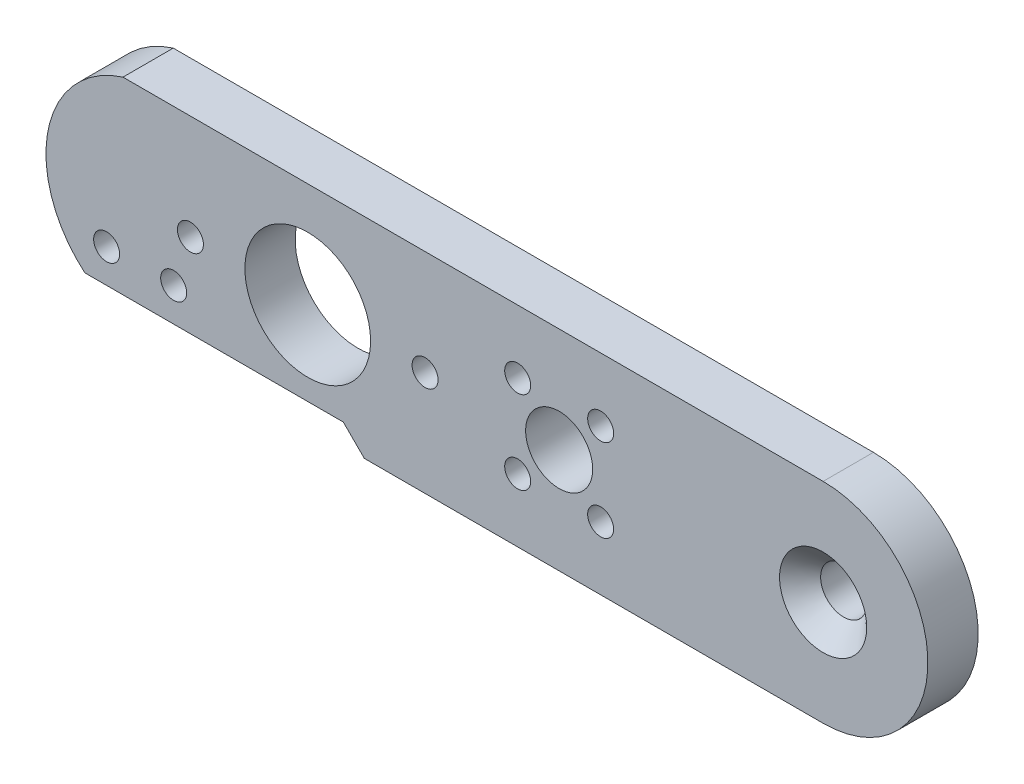
ISO-10303-21;
HEADER;
FILE_DESCRIPTION(('STEP AP214'),'2;1');
FILE_NAME('part.step','',(''),(''),'','','');
FILE_SCHEMA(('AUTOMOTIVE_DESIGN { 1 0 10303 214 1 1 1 1 }'));
ENDSEC;
DATA;
#1=APPLICATION_CONTEXT('core data for automotive mechanical design processes');
#2=APPLICATION_PROTOCOL_DEFINITION('international standard','automotive_design',2000,#1);
#3=PRODUCT_CONTEXT('',#1,'mechanical');
#4=PRODUCT('Part','Part','',(#3));
#5=PRODUCT_RELATED_PRODUCT_CATEGORY('part','',(#4));
#6=PRODUCT_DEFINITION_FORMATION('','',#4);
#7=PRODUCT_DEFINITION_CONTEXT('part definition',#1,'design');
#8=PRODUCT_DEFINITION('design','',#6,#7);
#9=PRODUCT_DEFINITION_SHAPE('','',#8);
#10=(LENGTH_UNIT() NAMED_UNIT(*) SI_UNIT(.MILLI.,.METRE.));
#11=(NAMED_UNIT(*) PLANE_ANGLE_UNIT() SI_UNIT($,.RADIAN.));
#12=(NAMED_UNIT(*) SI_UNIT($,.STERADIAN.) SOLID_ANGLE_UNIT());
#13=UNCERTAINTY_MEASURE_WITH_UNIT(LENGTH_MEASURE(1.E-05),#10,'distance_accuracy_value','');
#14=(GEOMETRIC_REPRESENTATION_CONTEXT(3) GLOBAL_UNCERTAINTY_ASSIGNED_CONTEXT((#13)) GLOBAL_UNIT_ASSIGNED_CONTEXT((#10,
#11,#12)) REPRESENTATION_CONTEXT('',''));
#15=CARTESIAN_POINT('',(0.,0.,0.));
#16=DIRECTION('',(0.,0.,1.));
#17=DIRECTION('',(1.,0.,0.));
#18=AXIS2_PLACEMENT_3D('',#15,#16,#17);
#19=CARTESIAN_POINT('',(-37.9889093793381,0.,6.));
#20=DIRECTION('',(0.,0.,1.));
#21=DIRECTION('',(1.,0.,0.));
#22=AXIS2_PLACEMENT_3D('',#19,#20,#21);
#23=PLANE('',#22);
#24=CARTESIAN_POINT('',(-43.8464721363555,-6.,6.));
#25=DIRECTION('',(0.,0.,1.));
#26=DIRECTION('',(1.,0.,0.));
#27=AXIS2_PLACEMENT_3D('',#24,#25,#26);
#28=CIRCLE('',#27,1.55);
#29=CARTESIAN_POINT('',(-42.2964721363555,-6.,6.));
#30=VERTEX_POINT('',#29);
#31=EDGE_CURVE('E250',#30,#30,#28,.T.);
#32=ORIENTED_EDGE('',*,*,#31,.F.);
#33=EDGE_LOOP('',(#32));
#34=FACE_BOUND('',#33,.T.);
#35=CARTESIAN_POINT('',(-35.8464721363555,-6.,6.));
#36=DIRECTION('',(0.,0.,1.));
#37=DIRECTION('',(1.,0.,0.));
#38=AXIS2_PLACEMENT_3D('',#35,#36,#37);
#39=CIRCLE('',#38,1.55);
#40=CARTESIAN_POINT('',(-34.2964721363555,-6.,6.));
#41=VERTEX_POINT('',#40);
#42=EDGE_CURVE('E254',#41,#41,#39,.T.);
#43=ORIENTED_EDGE('',*,*,#42,.F.);
#44=EDGE_LOOP('',(#43));
#45=FACE_BOUND('',#44,.T.);
#46=CARTESIAN_POINT('',(41.6532189288571,0.,6.));
#47=DIRECTION('',(0.,0.,1.));
#48=DIRECTION('',(1.,0.,0.));
#49=AXIS2_PLACEMENT_3D('',#46,#47,#48);
#50=CIRCLE('',#49,5.2);
#51=CARTESIAN_POINT('',(46.8532189288571,0.,6.));
#52=VERTEX_POINT('',#51);
#53=EDGE_CURVE('E253',#52,#52,#50,.T.);
#54=ORIENTED_EDGE('',*,*,#53,.F.);
#55=EDGE_LOOP('',(#54));
#56=FACE_BOUND('',#55,.T.);
#57=CARTESIAN_POINT('',(-19.8464721363555,0.,6.));
#58=DIRECTION('',(0.,0.,1.));
#59=DIRECTION('',(1.,0.,0.));
#60=AXIS2_PLACEMENT_3D('',#57,#58,#59);
#61=CIRCLE('',#60,7.5);
#62=CARTESIAN_POINT('',(-12.3464721363555,0.,6.));
#63=VERTEX_POINT('',#62);
#64=EDGE_CURVE('E270',#63,#63,#61,.T.);
#65=ORIENTED_EDGE('',*,*,#64,.F.);
#66=EDGE_LOOP('',(#65));
#67=FACE_BOUND('',#66,.T.);
#68=CARTESIAN_POINT('',(5.20378039533869,-4.94974746830586,6.));
#69=DIRECTION('',(0.,0.,1.));
#70=DIRECTION('',(1.,0.,0.));
#71=AXIS2_PLACEMENT_3D('',#68,#69,#70);
#72=CIRCLE('',#71,1.55);
#73=CARTESIAN_POINT('',(6.75378039533869,-4.94974746830586,6.));
#74=VERTEX_POINT('',#73);
#75=EDGE_CURVE('E282',#74,#74,#72,.T.);
#76=ORIENTED_EDGE('',*,*,#75,.F.);
#77=EDGE_LOOP('',(#76));
#78=FACE_BOUND('',#77,.T.);
#79=CARTESIAN_POINT('',(5.20378039533869,4.94974746830586,6.));
#80=DIRECTION('',(0.,0.,1.));
#81=DIRECTION('',(-1.,0.,0.));
#82=AXIS2_PLACEMENT_3D('',#79,#80,#81);
#83=CIRCLE('',#82,1.55);
#84=CARTESIAN_POINT('',(3.65378039533869,4.94974746830586,6.));
#85=VERTEX_POINT('',#84);
#86=EDGE_CURVE('E294',#85,#85,#83,.T.);
#87=ORIENTED_EDGE('',*,*,#86,.F.);
#88=EDGE_LOOP('',(#87));
#89=FACE_BOUND('',#88,.T.);
#90=CARTESIAN_POINT('',(10.1535278636445,0.,6.));
#91=DIRECTION('',(0.,0.,1.));
#92=DIRECTION('',(1.,0.,0.));
#93=AXIS2_PLACEMENT_3D('',#90,#91,#92);
#94=CIRCLE('',#93,4.);
#95=CARTESIAN_POINT('',(14.1535278636445,0.,6.));
#96=VERTEX_POINT('',#95);
#97=EDGE_CURVE('E123',#96,#96,#94,.T.);
#98=ORIENTED_EDGE('',*,*,#97,.F.);
#99=EDGE_LOOP('',(#98));
#100=FACE_BOUND('',#99,.T.);
#101=CARTESIAN_POINT('',(-37.9889093793381,0.,6.));
#102=DIRECTION('',(0.,0.,1.));
#103=DIRECTION('',(1.,0.,0.));
#104=AXIS2_PLACEMENT_3D('',#101,#102,#103);
#105=CIRCLE('',#104,13.0963518891253);
#106=CARTESIAN_POINT('',(-41.8958817114382,12.5,6.));
#107=VERTEX_POINT('',#106);
#108=CARTESIAN_POINT('',(-46.4455300284979,-10.,6.));
#109=VERTEX_POINT('',#108);
#110=EDGE_CURVE('E130',#107,#109,#105,.T.);
#111=ORIENTED_EDGE('',*,*,#110,.T.);
#112=DIRECTION('',(1.,0.,0.));
#113=VECTOR('',#112,1.);
#114=CARTESIAN_POINT('',(-46.4455300284979,-10.,6.));
#115=LINE('',#114,#113);
#116=CARTESIAN_POINT('',(-15.5989525530719,-10.,6.));
#117=VERTEX_POINT('',#116);
#118=EDGE_CURVE('E88',#109,#117,#115,.T.);
#119=ORIENTED_EDGE('',*,*,#118,.T.);
#120=DIRECTION('',(0.707106781186546,-0.707106781186548,0.));
#121=VECTOR('',#120,1.);
#122=CARTESIAN_POINT('',(-15.5989525530719,-10.,6.));
#123=LINE('',#122,#121);
#124=CARTESIAN_POINT('',(-13.0989525530719,-12.5,6.));
#125=VERTEX_POINT('',#124);
#126=EDGE_CURVE('E101',#117,#125,#123,.T.);
#127=ORIENTED_EDGE('',*,*,#126,.T.);
#128=DIRECTION('',(1.,0.,0.));
#129=VECTOR('',#128,1.);
#130=CARTESIAN_POINT('',(-13.0989525530719,-12.5,6.));
#131=LINE('',#130,#129);
#132=CARTESIAN_POINT('',(41.6532189288571,-12.5,6.));
#133=VERTEX_POINT('',#132);
#134=EDGE_CURVE('E95',#125,#133,#131,.T.);
#135=ORIENTED_EDGE('',*,*,#134,.T.);
#136=CARTESIAN_POINT('',(41.6532189288571,0.,6.));
#137=DIRECTION('',(0.,0.,1.));
#138=DIRECTION('',(1.,0.,0.));
#139=AXIS2_PLACEMENT_3D('',#136,#137,#138);
#140=CIRCLE('',#139,12.5);
#141=CARTESIAN_POINT('',(41.6532189288571,12.5,6.));
#142=VERTEX_POINT('',#141);
#143=EDGE_CURVE('E99',#133,#142,#140,.T.);
#144=ORIENTED_EDGE('',*,*,#143,.T.);
#145=DIRECTION('',(-1.,0.,0.));
#146=VECTOR('',#145,1.);
#147=CARTESIAN_POINT('',(-41.8958817114382,12.5,6.));
#148=LINE('',#147,#146);
#149=EDGE_CURVE('E51',#142,#107,#148,.T.);
#150=ORIENTED_EDGE('',*,*,#149,.T.);
#151=EDGE_LOOP('',(#111,#119,#127,#135,#144,#150));
#152=FACE_BOUND('',#151,.T.);
#153=CARTESIAN_POINT('',(15.1032753319503,4.94974746830586,6.));
#154=DIRECTION('',(0.,0.,1.));
#155=DIRECTION('',(1.,0.,0.));
#156=AXIS2_PLACEMENT_3D('',#153,#154,#155);
#157=CIRCLE('',#156,1.55);
#158=CARTESIAN_POINT('',(16.6532753319503,4.94974746830586,6.));
#159=VERTEX_POINT('',#158);
#160=EDGE_CURVE('E300',#159,#159,#157,.T.);
#161=ORIENTED_EDGE('',*,*,#160,.F.);
#162=EDGE_LOOP('',(#161));
#163=FACE_BOUND('',#162,.T.);
#164=CARTESIAN_POINT('',(15.1032753319503,-4.94974746830586,6.));
#165=DIRECTION('',(0.,0.,1.));
#166=DIRECTION('',(-1.,0.,0.));
#167=AXIS2_PLACEMENT_3D('',#164,#165,#166);
#168=CIRCLE('',#167,1.55);
#169=CARTESIAN_POINT('',(13.5532753319503,-4.94974746830586,6.));
#170=VERTEX_POINT('',#169);
#171=EDGE_CURVE('E288',#170,#170,#168,.T.);
#172=ORIENTED_EDGE('',*,*,#171,.F.);
#173=EDGE_LOOP('',(#172));
#174=FACE_BOUND('',#173,.T.);
#175=CARTESIAN_POINT('',(-33.8464721363555,0.,6.));
#176=DIRECTION('',(0.,0.,1.));
#177=DIRECTION('',(1.,0.,0.));
#178=AXIS2_PLACEMENT_3D('',#175,#176,#177);
#179=CIRCLE('',#178,1.55);
#180=CARTESIAN_POINT('',(-32.2964721363555,0.,6.));
#181=VERTEX_POINT('',#180);
#182=EDGE_CURVE('E276',#181,#181,#179,.T.);
#183=ORIENTED_EDGE('',*,*,#182,.F.);
#184=EDGE_LOOP('',(#183));
#185=FACE_BOUND('',#184,.T.);
#186=CARTESIAN_POINT('',(-5.84647213635551,0.,6.));
#187=DIRECTION('',(0.,0.,1.));
#188=DIRECTION('',(1.,0.,0.));
#189=AXIS2_PLACEMENT_3D('',#186,#187,#188);
#190=CIRCLE('',#189,1.55);
#191=CARTESIAN_POINT('',(-4.29647213635551,0.,6.));
#192=VERTEX_POINT('',#191);
#193=EDGE_CURVE('E263',#192,#192,#190,.T.);
#194=ORIENTED_EDGE('',*,*,#193,.F.);
#195=EDGE_LOOP('',(#194));
#196=FACE_BOUND('',#195,.T.);
#197=ADVANCED_FACE('F33',(#34,#45,#56,#67,#78,#89,#100,#152,#163,#174,#185,#196),#23,.T.);
#198=CARTESIAN_POINT('',(-37.9889093793381,0.,0.));
#199=DIRECTION('',(0.,0.,1.));
#200=DIRECTION('',(1.,0.,0.));
#201=AXIS2_PLACEMENT_3D('',#198,#199,#200);
#202=PLANE('',#201);
#203=CARTESIAN_POINT('',(-35.8464721363555,-6.,0.));
#204=DIRECTION('',(0.,0.,1.));
#205=DIRECTION('',(1.,0.,0.));
#206=AXIS2_PLACEMENT_3D('',#203,#204,#205);
#207=CIRCLE('',#206,3.);
#208=CARTESIAN_POINT('',(-32.8464721363555,-6.,0.));
#209=VERTEX_POINT('',#208);
#210=EDGE_CURVE('E236',#209,#209,#207,.T.);
#211=ORIENTED_EDGE('',*,*,#210,.T.);
#212=EDGE_LOOP('',(#211));
#213=FACE_BOUND('',#212,.T.);
#214=CARTESIAN_POINT('',(-43.8464721363555,-6.,0.));
#215=DIRECTION('',(0.,0.,1.));
#216=DIRECTION('',(1.,0.,0.));
#217=AXIS2_PLACEMENT_3D('',#214,#215,#216);
#218=CIRCLE('',#217,3.);
#219=CARTESIAN_POINT('',(-40.8464721363555,-6.,0.));
#220=VERTEX_POINT('',#219);
#221=EDGE_CURVE('E237',#220,#220,#218,.T.);
#222=ORIENTED_EDGE('',*,*,#221,.T.);
#223=EDGE_LOOP('',(#222));
#224=FACE_BOUND('',#223,.T.);
#225=CARTESIAN_POINT('',(41.6532189288571,0.,0.));
#226=DIRECTION('',(0.,0.,1.));
#227=DIRECTION('',(1.,0.,0.));
#228=AXIS2_PLACEMENT_3D('',#225,#226,#227);
#229=CIRCLE('',#228,2.74999999999999);
#230=CARTESIAN_POINT('',(44.4032189288571,0.,0.));
#231=VERTEX_POINT('',#230);
#232=EDGE_CURVE('E37',#231,#231,#229,.T.);
#233=ORIENTED_EDGE('',*,*,#232,.T.);
#234=EDGE_LOOP('',(#233));
#235=FACE_BOUND('',#234,.T.);
#236=CARTESIAN_POINT('',(-37.9889093793381,0.,0.));
#237=DIRECTION('',(0.,0.,1.));
#238=DIRECTION('',(1.,0.,0.));
#239=AXIS2_PLACEMENT_3D('',#236,#237,#238);
#240=CIRCLE('',#239,13.0963518891253);
#241=CARTESIAN_POINT('',(-41.8958817114382,12.5,0.));
#242=VERTEX_POINT('',#241);
#243=CARTESIAN_POINT('',(-46.4455300284979,-10.,0.));
#244=VERTEX_POINT('',#243);
#245=EDGE_CURVE('E119',#242,#244,#240,.T.);
#246=ORIENTED_EDGE('',*,*,#245,.F.);
#247=DIRECTION('',(-1.,0.,0.));
#248=VECTOR('',#247,1.);
#249=CARTESIAN_POINT('',(-41.8958817114382,12.5,0.));
#250=LINE('',#249,#248);
#251=CARTESIAN_POINT('',(41.6532189288571,12.5,0.));
#252=VERTEX_POINT('',#251);
#253=EDGE_CURVE('E80',#252,#242,#250,.T.);
#254=ORIENTED_EDGE('',*,*,#253,.F.);
#255=CARTESIAN_POINT('',(41.6532189288571,0.,0.));
#256=DIRECTION('',(0.,0.,1.));
#257=DIRECTION('',(1.,0.,0.));
#258=AXIS2_PLACEMENT_3D('',#255,#256,#257);
#259=CIRCLE('',#258,12.5);
#260=CARTESIAN_POINT('',(41.6532189288571,-12.5,0.));
#261=VERTEX_POINT('',#260);
#262=EDGE_CURVE('E74',#261,#252,#259,.T.);
#263=ORIENTED_EDGE('',*,*,#262,.F.);
#264=DIRECTION('',(1.,0.,0.));
#265=VECTOR('',#264,1.);
#266=CARTESIAN_POINT('',(-13.0989525530719,-12.5,0.));
#267=LINE('',#266,#265);
#268=CARTESIAN_POINT('',(-13.0989525530719,-12.5,0.));
#269=VERTEX_POINT('',#268);
#270=EDGE_CURVE('E109',#269,#261,#267,.T.);
#271=ORIENTED_EDGE('',*,*,#270,.F.);
#272=DIRECTION('',(0.707106781186546,-0.707106781186548,0.));
#273=VECTOR('',#272,1.);
#274=CARTESIAN_POINT('',(-15.5989525530719,-10.,0.));
#275=LINE('',#274,#273);
#276=CARTESIAN_POINT('',(-15.5989525530719,-10.,0.));
#277=VERTEX_POINT('',#276);
#278=EDGE_CURVE('E125',#277,#269,#275,.T.);
#279=ORIENTED_EDGE('',*,*,#278,.F.);
#280=DIRECTION('',(1.,0.,0.));
#281=VECTOR('',#280,1.);
#282=CARTESIAN_POINT('',(-46.4455300284979,-10.,0.));
#283=LINE('',#282,#281);
#284=EDGE_CURVE('E122',#244,#277,#283,.T.);
#285=ORIENTED_EDGE('',*,*,#284,.F.);
#286=EDGE_LOOP('',(#246,#254,#263,#271,#279,#285));
#287=FACE_BOUND('',#286,.T.);
#288=CARTESIAN_POINT('',(10.1535278636445,0.,0.));
#289=DIRECTION('',(0.,0.,1.));
#290=DIRECTION('',(1.,0.,0.));
#291=AXIS2_PLACEMENT_3D('',#288,#289,#290);
#292=CIRCLE('',#291,4.);
#293=CARTESIAN_POINT('',(14.1535278636445,0.,0.));
#294=VERTEX_POINT('',#293);
#295=EDGE_CURVE('E303',#294,#294,#292,.T.);
#296=ORIENTED_EDGE('',*,*,#295,.T.);
#297=EDGE_LOOP('',(#296));
#298=FACE_BOUND('',#297,.T.);
#299=CARTESIAN_POINT('',(15.1032753319503,4.94974746830586,0.));
#300=DIRECTION('',(0.,0.,1.));
#301=DIRECTION('',(1.,0.,0.));
#302=AXIS2_PLACEMENT_3D('',#299,#300,#301);
#303=CIRCLE('',#302,1.55);
#304=CARTESIAN_POINT('',(16.6532753319503,4.94974746830586,0.));
#305=VERTEX_POINT('',#304);
#306=EDGE_CURVE('E297',#305,#305,#303,.T.);
#307=ORIENTED_EDGE('',*,*,#306,.T.);
#308=EDGE_LOOP('',(#307));
#309=FACE_BOUND('',#308,.T.);
#310=CARTESIAN_POINT('',(5.20378039533869,4.94974746830586,0.));
#311=DIRECTION('',(0.,0.,1.));
#312=DIRECTION('',(-1.,0.,0.));
#313=AXIS2_PLACEMENT_3D('',#310,#311,#312);
#314=CIRCLE('',#313,1.55);
#315=CARTESIAN_POINT('',(3.65378039533869,4.94974746830586,0.));
#316=VERTEX_POINT('',#315);
#317=EDGE_CURVE('E291',#316,#316,#314,.T.);
#318=ORIENTED_EDGE('',*,*,#317,.T.);
#319=EDGE_LOOP('',(#318));
#320=FACE_BOUND('',#319,.T.);
#321=CARTESIAN_POINT('',(15.1032753319503,-4.94974746830586,0.));
#322=DIRECTION('',(0.,0.,1.));
#323=DIRECTION('',(-1.,0.,0.));
#324=AXIS2_PLACEMENT_3D('',#321,#322,#323);
#325=CIRCLE('',#324,1.55);
#326=CARTESIAN_POINT('',(13.5532753319503,-4.94974746830586,0.));
#327=VERTEX_POINT('',#326);
#328=EDGE_CURVE('E285',#327,#327,#325,.T.);
#329=ORIENTED_EDGE('',*,*,#328,.T.);
#330=EDGE_LOOP('',(#329));
#331=FACE_BOUND('',#330,.T.);
#332=CARTESIAN_POINT('',(5.20378039533869,-4.94974746830586,0.));
#333=DIRECTION('',(0.,0.,1.));
#334=DIRECTION('',(1.,0.,0.));
#335=AXIS2_PLACEMENT_3D('',#332,#333,#334);
#336=CIRCLE('',#335,1.55);
#337=CARTESIAN_POINT('',(6.75378039533869,-4.94974746830586,0.));
#338=VERTEX_POINT('',#337);
#339=EDGE_CURVE('E279',#338,#338,#336,.T.);
#340=ORIENTED_EDGE('',*,*,#339,.T.);
#341=EDGE_LOOP('',(#340));
#342=FACE_BOUND('',#341,.T.);
#343=CARTESIAN_POINT('',(-33.8464721363555,0.,0.));
#344=DIRECTION('',(0.,0.,1.));
#345=DIRECTION('',(1.,0.,0.));
#346=AXIS2_PLACEMENT_3D('',#343,#344,#345);
#347=CIRCLE('',#346,1.55);
#348=CARTESIAN_POINT('',(-32.2964721363555,0.,0.));
#349=VERTEX_POINT('',#348);
#350=EDGE_CURVE('E273',#349,#349,#347,.T.);
#351=ORIENTED_EDGE('',*,*,#350,.T.);
#352=EDGE_LOOP('',(#351));
#353=FACE_BOUND('',#352,.T.);
#354=CARTESIAN_POINT('',(-19.8464721363555,0.,0.));
#355=DIRECTION('',(0.,0.,1.));
#356=DIRECTION('',(1.,0.,0.));
#357=AXIS2_PLACEMENT_3D('',#354,#355,#356);
#358=CIRCLE('',#357,7.5);
#359=CARTESIAN_POINT('',(-12.3464721363555,0.,0.));
#360=VERTEX_POINT('',#359);
#361=EDGE_CURVE('E266',#360,#360,#358,.T.);
#362=ORIENTED_EDGE('',*,*,#361,.T.);
#363=EDGE_LOOP('',(#362));
#364=FACE_BOUND('',#363,.T.);
#365=CARTESIAN_POINT('',(-5.84647213635551,0.,0.));
#366=DIRECTION('',(0.,0.,1.));
#367=DIRECTION('',(1.,0.,0.));
#368=AXIS2_PLACEMENT_3D('',#365,#366,#367);
#369=CIRCLE('',#368,1.55);
#370=CARTESIAN_POINT('',(-4.29647213635551,0.,0.));
#371=VERTEX_POINT('',#370);
#372=EDGE_CURVE('E267',#371,#371,#369,.T.);
#373=ORIENTED_EDGE('',*,*,#372,.T.);
#374=EDGE_LOOP('',(#373));
#375=FACE_BOUND('',#374,.T.);
#376=ADVANCED_FACE('F140',(#213,#224,#235,#287,#298,#309,#320,#331,#342,#353,#364,#375),#202,.F.);
#377=CARTESIAN_POINT('',(-37.9889093793381,0.,6.));
#378=DIRECTION('',(0.,0.,-1.));
#379=DIRECTION('',(-1.,0.,0.));
#380=AXIS2_PLACEMENT_3D('',#377,#378,#379);
#381=CYLINDRICAL_SURFACE('',#380,13.0963518891253);
#382=ORIENTED_EDGE('',*,*,#245,.T.);
#383=DIRECTION('',(0.,0.,-1.));
#384=VECTOR('',#383,1.);
#385=CARTESIAN_POINT('',(-46.4455300284979,-10.,6.));
#386=LINE('',#385,#384);
#387=EDGE_CURVE('E11',#109,#244,#386,.T.);
#388=ORIENTED_EDGE('',*,*,#387,.F.);
#389=ORIENTED_EDGE('',*,*,#110,.F.);
#390=DIRECTION('',(0.,0.,-1.));
#391=VECTOR('',#390,1.);
#392=CARTESIAN_POINT('',(-41.8958817114382,12.5,6.));
#393=LINE('',#392,#391);
#394=EDGE_CURVE('E115',#107,#242,#393,.T.);
#395=ORIENTED_EDGE('',*,*,#394,.T.);
#396=EDGE_LOOP('',(#382,#388,#389,#395));
#397=FACE_BOUND('',#396,.T.);
#398=ADVANCED_FACE('F35',(#397),#381,.T.);
#399=CARTESIAN_POINT('',(-46.4455300284979,-10.,6.));
#400=DIRECTION('',(0.,1.,0.));
#401=DIRECTION('',(0.,0.,1.));
#402=AXIS2_PLACEMENT_3D('',#399,#400,#401);
#403=PLANE('',#402);
#404=ORIENTED_EDGE('',*,*,#284,.T.);
#405=DIRECTION('',(0.,0.,-1.));
#406=VECTOR('',#405,1.);
#407=CARTESIAN_POINT('',(-15.5989525530719,-10.,6.));
#408=LINE('',#407,#406);
#409=EDGE_CURVE('E43',#117,#277,#408,.T.);
#410=ORIENTED_EDGE('',*,*,#409,.F.);
#411=ORIENTED_EDGE('',*,*,#118,.F.);
#412=ORIENTED_EDGE('',*,*,#387,.T.);
#413=EDGE_LOOP('',(#404,#410,#411,#412));
#414=FACE_BOUND('',#413,.T.);
#415=ADVANCED_FACE('F455',(#414),#403,.F.);
#416=CARTESIAN_POINT('',(-15.5989525530719,-10.,6.));
#417=DIRECTION('',(0.707106781186549,0.707106781186547,0.));
#418=DIRECTION('',(-0.707106781186547,0.707106781186549,0.));
#419=AXIS2_PLACEMENT_3D('',#416,#417,#418);
#420=PLANE('',#419);
#421=ORIENTED_EDGE('',*,*,#278,.T.);
#422=DIRECTION('',(0.,0.,-1.));
#423=VECTOR('',#422,1.);
#424=CARTESIAN_POINT('',(-13.0989525530719,-12.5,6.));
#425=LINE('',#424,#423);
#426=EDGE_CURVE('E110',#125,#269,#425,.T.);
#427=ORIENTED_EDGE('',*,*,#426,.F.);
#428=ORIENTED_EDGE('',*,*,#126,.F.);
#429=ORIENTED_EDGE('',*,*,#409,.T.);
#430=EDGE_LOOP('',(#421,#427,#428,#429));
#431=FACE_BOUND('',#430,.T.);
#432=ADVANCED_FACE('F137',(#431),#420,.F.);
#433=CARTESIAN_POINT('',(-13.0989525530719,-12.5,6.));
#434=DIRECTION('',(0.,1.,0.));
#435=DIRECTION('',(-1.,0.,0.));
#436=AXIS2_PLACEMENT_3D('',#433,#434,#435);
#437=PLANE('',#436);
#438=ORIENTED_EDGE('',*,*,#270,.T.);
#439=DIRECTION('',(0.,0.,-1.));
#440=VECTOR('',#439,1.);
#441=CARTESIAN_POINT('',(41.6532189288571,-12.5,6.));
#442=LINE('',#441,#440);
#443=EDGE_CURVE('E106',#133,#261,#442,.T.);
#444=ORIENTED_EDGE('',*,*,#443,.F.);
#445=ORIENTED_EDGE('',*,*,#134,.F.);
#446=ORIENTED_EDGE('',*,*,#426,.T.);
#447=EDGE_LOOP('',(#438,#444,#445,#446));
#448=FACE_BOUND('',#447,.T.);
#449=ADVANCED_FACE('F107',(#448),#437,.F.);
#450=CARTESIAN_POINT('',(41.6532189288571,0.,6.));
#451=DIRECTION('',(0.,0.,-1.));
#452=DIRECTION('',(-1.,0.,0.));
#453=AXIS2_PLACEMENT_3D('',#450,#451,#452);
#454=CYLINDRICAL_SURFACE('',#453,12.5);
#455=ORIENTED_EDGE('',*,*,#262,.T.);
#456=DIRECTION('',(0.,0.,-1.));
#457=VECTOR('',#456,1.);
#458=CARTESIAN_POINT('',(41.6532189288571,12.5,6.));
#459=LINE('',#458,#457);
#460=EDGE_CURVE('E111',#142,#252,#459,.T.);
#461=ORIENTED_EDGE('',*,*,#460,.F.);
#462=ORIENTED_EDGE('',*,*,#143,.F.);
#463=ORIENTED_EDGE('',*,*,#443,.T.);
#464=EDGE_LOOP('',(#455,#461,#462,#463));
#465=FACE_BOUND('',#464,.T.);
#466=ADVANCED_FACE('F113',(#465),#454,.T.);
#467=CARTESIAN_POINT('',(-41.8958817114382,12.5,6.));
#468=DIRECTION('',(0.,-1.,0.));
#469=DIRECTION('',(0.,0.,-1.));
#470=AXIS2_PLACEMENT_3D('',#467,#468,#469);
#471=PLANE('',#470);
#472=ORIENTED_EDGE('',*,*,#253,.T.);
#473=ORIENTED_EDGE('',*,*,#394,.F.);
#474=ORIENTED_EDGE('',*,*,#149,.F.);
#475=ORIENTED_EDGE('',*,*,#460,.T.);
#476=EDGE_LOOP('',(#472,#473,#474,#475));
#477=FACE_BOUND('',#476,.T.);
#478=ADVANCED_FACE('F145',(#477),#471,.F.);
#479=CARTESIAN_POINT('',(10.1535278636445,0.,6.));
#480=DIRECTION('',(0.,0.,-1.));
#481=DIRECTION('',(-1.,0.,0.));
#482=AXIS2_PLACEMENT_3D('',#479,#480,#481);
#483=CYLINDRICAL_SURFACE('',#482,4.);
#484=ORIENTED_EDGE('',*,*,#97,.T.);
#485=EDGE_LOOP('',(#484));
#486=FACE_BOUND('',#485,.T.);
#487=ORIENTED_EDGE('',*,*,#295,.F.);
#488=EDGE_LOOP('',(#487));
#489=FACE_BOUND('',#488,.T.);
#490=ADVANCED_FACE('F147',(#486,#489),#483,.F.);
#491=CARTESIAN_POINT('',(15.1032753319503,4.94974746830586,6.));
#492=DIRECTION('',(0.,0.,-1.));
#493=DIRECTION('',(-1.,0.,0.));
#494=AXIS2_PLACEMENT_3D('',#491,#492,#493);
#495=CYLINDRICAL_SURFACE('',#494,1.55);
#496=ORIENTED_EDGE('',*,*,#160,.T.);
#497=EDGE_LOOP('',(#496));
#498=FACE_BOUND('',#497,.T.);
#499=ORIENTED_EDGE('',*,*,#306,.F.);
#500=EDGE_LOOP('',(#499));
#501=FACE_BOUND('',#500,.T.);
#502=ADVANCED_FACE('F153',(#498,#501),#495,.F.);
#503=CARTESIAN_POINT('',(5.20378039533869,4.94974746830586,6.));
#504=DIRECTION('',(0.,0.,-1.));
#505=DIRECTION('',(-1.,0.,0.));
#506=AXIS2_PLACEMENT_3D('',#503,#504,#505);
#507=CYLINDRICAL_SURFACE('',#506,1.55);
#508=ORIENTED_EDGE('',*,*,#86,.T.);
#509=EDGE_LOOP('',(#508));
#510=FACE_BOUND('',#509,.T.);
#511=ORIENTED_EDGE('',*,*,#317,.F.);
#512=EDGE_LOOP('',(#511));
#513=FACE_BOUND('',#512,.T.);
#514=ADVANCED_FACE('F170',(#510,#513),#507,.F.);
#515=CARTESIAN_POINT('',(15.1032753319503,-4.94974746830586,6.));
#516=DIRECTION('',(0.,0.,-1.));
#517=DIRECTION('',(-1.,0.,0.));
#518=AXIS2_PLACEMENT_3D('',#515,#516,#517);
#519=CYLINDRICAL_SURFACE('',#518,1.55);
#520=ORIENTED_EDGE('',*,*,#171,.T.);
#521=EDGE_LOOP('',(#520));
#522=FACE_BOUND('',#521,.T.);
#523=ORIENTED_EDGE('',*,*,#328,.F.);
#524=EDGE_LOOP('',(#523));
#525=FACE_BOUND('',#524,.T.);
#526=ADVANCED_FACE('F174',(#522,#525),#519,.F.);
#527=CARTESIAN_POINT('',(5.20378039533869,-4.94974746830586,6.));
#528=DIRECTION('',(0.,0.,-1.));
#529=DIRECTION('',(-1.,0.,0.));
#530=AXIS2_PLACEMENT_3D('',#527,#528,#529);
#531=CYLINDRICAL_SURFACE('',#530,1.55);
#532=ORIENTED_EDGE('',*,*,#75,.T.);
#533=EDGE_LOOP('',(#532));
#534=FACE_BOUND('',#533,.T.);
#535=ORIENTED_EDGE('',*,*,#339,.F.);
#536=EDGE_LOOP('',(#535));
#537=FACE_BOUND('',#536,.T.);
#538=ADVANCED_FACE('F178',(#534,#537),#531,.F.);
#539=CARTESIAN_POINT('',(-33.8464721363555,0.,6.));
#540=DIRECTION('',(0.,0.,-1.));
#541=DIRECTION('',(-1.,0.,0.));
#542=AXIS2_PLACEMENT_3D('',#539,#540,#541);
#543=CYLINDRICAL_SURFACE('',#542,1.55);
#544=ORIENTED_EDGE('',*,*,#182,.T.);
#545=EDGE_LOOP('',(#544));
#546=FACE_BOUND('',#545,.T.);
#547=ORIENTED_EDGE('',*,*,#350,.F.);
#548=EDGE_LOOP('',(#547));
#549=FACE_BOUND('',#548,.T.);
#550=ADVANCED_FACE('F182',(#546,#549),#543,.F.);
#551=CARTESIAN_POINT('',(-19.8464721363555,0.,6.));
#552=DIRECTION('',(0.,0.,-1.));
#553=DIRECTION('',(-1.,0.,0.));
#554=AXIS2_PLACEMENT_3D('',#551,#552,#553);
#555=CYLINDRICAL_SURFACE('',#554,7.5);
#556=ORIENTED_EDGE('',*,*,#64,.T.);
#557=EDGE_LOOP('',(#556));
#558=FACE_BOUND('',#557,.T.);
#559=ORIENTED_EDGE('',*,*,#361,.F.);
#560=EDGE_LOOP('',(#559));
#561=FACE_BOUND('',#560,.T.);
#562=ADVANCED_FACE('F186',(#558,#561),#555,.F.);
#563=CARTESIAN_POINT('',(-5.84647213635551,0.,6.));
#564=DIRECTION('',(0.,0.,-1.));
#565=DIRECTION('',(-1.,0.,0.));
#566=AXIS2_PLACEMENT_3D('',#563,#564,#565);
#567=CYLINDRICAL_SURFACE('',#566,1.55);
#568=ORIENTED_EDGE('',*,*,#193,.T.);
#569=EDGE_LOOP('',(#568));
#570=FACE_BOUND('',#569,.T.);
#571=ORIENTED_EDGE('',*,*,#372,.F.);
#572=EDGE_LOOP('',(#571));
#573=FACE_BOUND('',#572,.T.);
#574=ADVANCED_FACE('F190',(#570,#573),#567,.F.);
#575=CARTESIAN_POINT('',(41.6532189288571,0.,6.));
#576=DIRECTION('',(0.,0.,1.));
#577=DIRECTION('',(1.,0.,0.));
#578=AXIS2_PLACEMENT_3D('',#575,#576,#577);
#579=CYLINDRICAL_SURFACE('',#578,2.74999999999999);
#580=CARTESIAN_POINT('',(41.6532189288571,0.,3.54999999999999));
#581=DIRECTION('',(0.,0.,1.));
#582=DIRECTION('',(1.,0.,0.));
#583=AXIS2_PLACEMENT_3D('',#580,#581,#582);
#584=CIRCLE('',#583,2.74999999999999);
#585=CARTESIAN_POINT('',(44.4032189288571,0.,3.54999999999999));
#586=VERTEX_POINT('',#585);
#587=EDGE_CURVE('E260',#586,#586,#584,.T.);
#588=ORIENTED_EDGE('',*,*,#587,.T.);
#589=EDGE_LOOP('',(#588));
#590=FACE_BOUND('',#589,.T.);
#591=ORIENTED_EDGE('',*,*,#232,.F.);
#592=EDGE_LOOP('',(#591));
#593=FACE_BOUND('',#592,.T.);
#594=ADVANCED_FACE('F194',(#590,#593),#579,.F.);
#595=CARTESIAN_POINT('',(41.6532189288571,0.,6.));
#596=DIRECTION('',(0.,0.,1.));
#597=DIRECTION('',(1.,0.,0.));
#598=AXIS2_PLACEMENT_3D('',#595,#596,#597);
#599=CONICAL_SURFACE('',#598,5.2,0.785398163397449);
#600=ORIENTED_EDGE('',*,*,#587,.F.);
#601=EDGE_LOOP('',(#600));
#602=FACE_BOUND('',#601,.T.);
#603=ORIENTED_EDGE('',*,*,#53,.T.);
#604=EDGE_LOOP('',(#603));
#605=FACE_BOUND('',#604,.T.);
#606=ADVANCED_FACE('F198',(#602,#605),#599,.F.);
#607=CARTESIAN_POINT('',(-35.8464721363555,-6.,3.));
#608=DIRECTION('',(0.,0.,1.));
#609=DIRECTION('',(1.,0.,0.));
#610=AXIS2_PLACEMENT_3D('',#607,#608,#609);
#611=CYLINDRICAL_SURFACE('',#610,1.55);
#612=CARTESIAN_POINT('',(-35.8464721363555,-6.,3.));
#613=DIRECTION('',(0.,0.,1.));
#614=DIRECTION('',(1.,0.,0.));
#615=AXIS2_PLACEMENT_3D('',#612,#613,#614);
#616=CIRCLE('',#615,1.55);
#617=CARTESIAN_POINT('',(-34.2964721363555,-6.,3.));
#618=VERTEX_POINT('',#617);
#619=EDGE_CURVE('E231',#618,#618,#616,.T.);
#620=ORIENTED_EDGE('',*,*,#619,.F.);
#621=EDGE_LOOP('',(#620));
#622=FACE_BOUND('',#621,.T.);
#623=ORIENTED_EDGE('',*,*,#42,.T.);
#624=EDGE_LOOP('',(#623));
#625=FACE_BOUND('',#624,.T.);
#626=ADVANCED_FACE('F202',(#622,#625),#611,.F.);
#627=CARTESIAN_POINT('',(-43.8464721363555,-6.,3.));
#628=DIRECTION('',(0.,0.,1.));
#629=DIRECTION('',(1.,0.,0.));
#630=AXIS2_PLACEMENT_3D('',#627,#628,#629);
#631=CYLINDRICAL_SURFACE('',#630,1.55);
#632=CARTESIAN_POINT('',(-43.8464721363555,-6.,3.));
#633=DIRECTION('',(0.,0.,1.));
#634=DIRECTION('',(1.,0.,0.));
#635=AXIS2_PLACEMENT_3D('',#632,#633,#634);
#636=CIRCLE('',#635,1.55);
#637=CARTESIAN_POINT('',(-42.2964721363555,-6.,3.));
#638=VERTEX_POINT('',#637);
#639=EDGE_CURVE('E240',#638,#638,#636,.T.);
#640=ORIENTED_EDGE('',*,*,#639,.F.);
#641=EDGE_LOOP('',(#640));
#642=FACE_BOUND('',#641,.T.);
#643=ORIENTED_EDGE('',*,*,#31,.T.);
#644=EDGE_LOOP('',(#643));
#645=FACE_BOUND('',#644,.T.);
#646=ADVANCED_FACE('F206',(#642,#645),#631,.F.);
#647=CARTESIAN_POINT('',(-43.8464721363555,-6.,0.));
#648=DIRECTION('',(0.,0.,1.));
#649=DIRECTION('',(1.,0.,0.));
#650=AXIS2_PLACEMENT_3D('',#647,#648,#649);
#651=CYLINDRICAL_SURFACE('',#650,3.);
#652=ORIENTED_EDGE('',*,*,#221,.F.);
#653=EDGE_LOOP('',(#652));
#654=FACE_BOUND('',#653,.T.);
#655=CARTESIAN_POINT('',(-43.8464721363555,-6.,3.));
#656=DIRECTION('',(0.,0.,1.));
#657=DIRECTION('',(1.,0.,0.));
#658=AXIS2_PLACEMENT_3D('',#655,#656,#657);
#659=CIRCLE('',#658,3.);
#660=CARTESIAN_POINT('',(-40.8464721363555,-6.,3.));
#661=VERTEX_POINT('',#660);
#662=EDGE_CURVE('E243',#661,#661,#659,.T.);
#663=ORIENTED_EDGE('',*,*,#662,.T.);
#664=EDGE_LOOP('',(#663));
#665=FACE_BOUND('',#664,.T.);
#666=ADVANCED_FACE('F210',(#654,#665),#651,.F.);
#667=CARTESIAN_POINT('',(-43.8464721363555,-6.,3.));
#668=DIRECTION('',(0.,0.,1.));
#669=DIRECTION('',(1.,0.,0.));
#670=AXIS2_PLACEMENT_3D('',#667,#668,#669);
#671=PLANE('',#670);
#672=ORIENTED_EDGE('',*,*,#639,.T.);
#673=EDGE_LOOP('',(#672));
#674=FACE_BOUND('',#673,.T.);
#675=ORIENTED_EDGE('',*,*,#662,.F.);
#676=EDGE_LOOP('',(#675));
#677=FACE_BOUND('',#676,.T.);
#678=ADVANCED_FACE('F214',(#674,#677),#671,.F.);
#679=CARTESIAN_POINT('',(-35.8464721363555,-6.,0.));
#680=DIRECTION('',(0.,0.,1.));
#681=DIRECTION('',(1.,0.,0.));
#682=AXIS2_PLACEMENT_3D('',#679,#680,#681);
#683=CYLINDRICAL_SURFACE('',#682,3.);
#684=ORIENTED_EDGE('',*,*,#210,.F.);
#685=EDGE_LOOP('',(#684));
#686=FACE_BOUND('',#685,.T.);
#687=CARTESIAN_POINT('',(-35.8464721363555,-6.,3.));
#688=DIRECTION('',(0.,0.,1.));
#689=DIRECTION('',(1.,0.,0.));
#690=AXIS2_PLACEMENT_3D('',#687,#688,#689);
#691=CIRCLE('',#690,3.);
#692=CARTESIAN_POINT('',(-32.8464721363555,-6.,3.));
#693=VERTEX_POINT('',#692);
#694=EDGE_CURVE('E234',#693,#693,#691,.T.);
#695=ORIENTED_EDGE('',*,*,#694,.T.);
#696=EDGE_LOOP('',(#695));
#697=FACE_BOUND('',#696,.T.);
#698=ADVANCED_FACE('F218',(#686,#697),#683,.F.);
#699=CARTESIAN_POINT('',(-35.8464721363555,-6.,3.));
#700=DIRECTION('',(0.,0.,1.));
#701=DIRECTION('',(1.,0.,0.));
#702=AXIS2_PLACEMENT_3D('',#699,#700,#701);
#703=PLANE('',#702);
#704=ORIENTED_EDGE('',*,*,#619,.T.);
#705=EDGE_LOOP('',(#704));
#706=FACE_BOUND('',#705,.T.);
#707=ORIENTED_EDGE('',*,*,#694,.F.);
#708=EDGE_LOOP('',(#707));
#709=FACE_BOUND('',#708,.T.);
#710=ADVANCED_FACE('F222',(#706,#709),#703,.F.);
#711=CLOSED_SHELL('',(#197,#376,#398,#415,#432,#449,#466,#478,#490,#502,#514,#526,#538,#550,
#562,#574,#594,#606,#626,#646,#666,#678,#698,#710));
#712=MANIFOLD_SOLID_BREP('B2',#711);
#713=ADVANCED_BREP_SHAPE_REPRESENTATION('',(#18,#712),#14);
#714=SHAPE_DEFINITION_REPRESENTATION(#9,#713);
ENDSEC;
END-ISO-10303-21;
